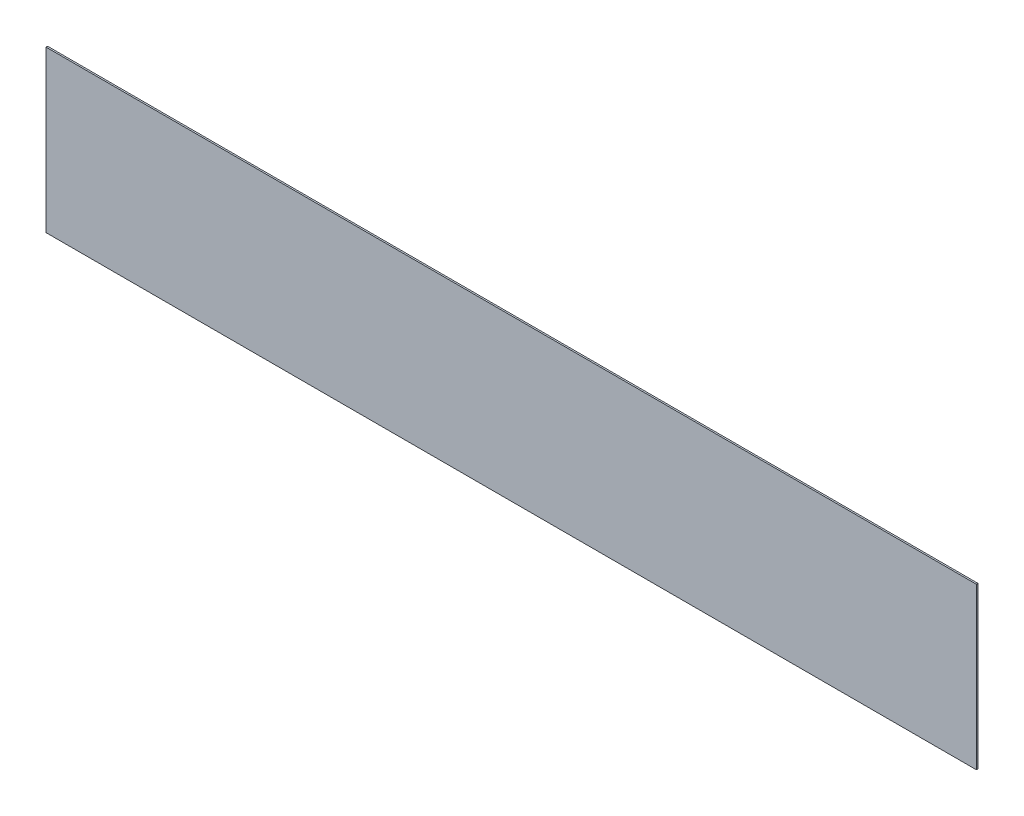
ISO-10303-21;
HEADER;
FILE_DESCRIPTION(('STEP AP214'),'2;1');
FILE_NAME('part.step','',(''),(''),'','','');
FILE_SCHEMA(('AUTOMOTIVE_DESIGN { 1 0 10303 214 1 1 1 1 }'));
ENDSEC;
DATA;
#1=APPLICATION_CONTEXT('core data for automotive mechanical design processes');
#2=APPLICATION_PROTOCOL_DEFINITION('international standard','automotive_design',2000,#1);
#3=PRODUCT_CONTEXT('',#1,'mechanical');
#4=PRODUCT('Part','Part','',(#3));
#5=PRODUCT_RELATED_PRODUCT_CATEGORY('part','',(#4));
#6=PRODUCT_DEFINITION_FORMATION('','',#4);
#7=PRODUCT_DEFINITION_CONTEXT('part definition',#1,'design');
#8=PRODUCT_DEFINITION('design','',#6,#7);
#9=PRODUCT_DEFINITION_SHAPE('','',#8);
#10=(LENGTH_UNIT() NAMED_UNIT(*) SI_UNIT(.MILLI.,.METRE.));
#11=(NAMED_UNIT(*) PLANE_ANGLE_UNIT() SI_UNIT($,.RADIAN.));
#12=(NAMED_UNIT(*) SI_UNIT($,.STERADIAN.) SOLID_ANGLE_UNIT());
#13=UNCERTAINTY_MEASURE_WITH_UNIT(LENGTH_MEASURE(1.E-05),#10,'distance_accuracy_value','');
#14=(GEOMETRIC_REPRESENTATION_CONTEXT(3) GLOBAL_UNCERTAINTY_ASSIGNED_CONTEXT((#13)) GLOBAL_UNIT_ASSIGNED_CONTEXT((#10,
#11,#12)) REPRESENTATION_CONTEXT('',''));
#15=CARTESIAN_POINT('',(0.,0.,0.));
#16=DIRECTION('',(0.,0.,1.));
#17=DIRECTION('',(1.,0.,0.));
#18=AXIS2_PLACEMENT_3D('',#15,#16,#17);
#19=CARTESIAN_POINT('',(13.7,4.,-700.));
#20=DIRECTION('',(-1.,0.,0.));
#21=DIRECTION('',(0.,0.,1.));
#22=AXIS2_PLACEMENT_3D('',#19,#20,#21);
#23=PLANE('',#22);
#24=DIRECTION('',(0.,-1.,0.));
#25=VECTOR('',#24,1.);
#26=CARTESIAN_POINT('',(13.7,4.,-699.));
#27=LINE('',#26,#25);
#28=CARTESIAN_POINT('',(13.7,106.,-699.));
#29=VERTEX_POINT('',#28);
#30=CARTESIAN_POINT('',(13.7,4.,-699.));
#31=VERTEX_POINT('',#30);
#32=EDGE_CURVE('E103',#29,#31,#27,.T.);
#33=ORIENTED_EDGE('',*,*,#32,.F.);
#34=DIRECTION('',(0.,0.,1.));
#35=VECTOR('',#34,1.);
#36=CARTESIAN_POINT('',(13.7,106.,-700.));
#37=LINE('',#36,#35);
#38=CARTESIAN_POINT('',(13.7,106.,-700.));
#39=VERTEX_POINT('',#38);
#40=EDGE_CURVE('E11',#39,#29,#37,.T.);
#41=ORIENTED_EDGE('',*,*,#40,.F.);
#42=DIRECTION('',(0.,-1.,0.));
#43=VECTOR('',#42,1.);
#44=CARTESIAN_POINT('',(13.7,4.,-700.));
#45=LINE('',#44,#43);
#46=CARTESIAN_POINT('',(13.7,4.,-700.));
#47=VERTEX_POINT('',#46);
#48=EDGE_CURVE('E97',#39,#47,#45,.T.);
#49=ORIENTED_EDGE('',*,*,#48,.T.);
#50=DIRECTION('',(0.,0.,1.));
#51=VECTOR('',#50,1.);
#52=CARTESIAN_POINT('',(13.7,4.,-700.));
#53=LINE('',#52,#51);
#54=EDGE_CURVE('E42',#47,#31,#53,.T.);
#55=ORIENTED_EDGE('',*,*,#54,.T.);
#56=EDGE_LOOP('',(#33,#41,#49,#55));
#57=FACE_BOUND('',#56,.T.);
#58=ADVANCED_FACE('F39',(#57),#23,.T.);
#59=CARTESIAN_POINT('',(13.7,106.,-700.));
#60=DIRECTION('',(0.,1.,0.));
#61=DIRECTION('',(0.,0.,1.));
#62=AXIS2_PLACEMENT_3D('',#59,#60,#61);
#63=PLANE('',#62);
#64=DIRECTION('',(-1.,0.,0.));
#65=VECTOR('',#64,1.);
#66=CARTESIAN_POINT('',(13.7,106.,-699.));
#67=LINE('',#66,#65);
#68=CARTESIAN_POINT('',(604.3,106.,-699.));
#69=VERTEX_POINT('',#68);
#70=EDGE_CURVE('E99',#69,#29,#67,.T.);
#71=ORIENTED_EDGE('',*,*,#70,.F.);
#72=DIRECTION('',(0.,0.,1.));
#73=VECTOR('',#72,1.);
#74=CARTESIAN_POINT('',(604.3,106.,-700.));
#75=LINE('',#74,#73);
#76=CARTESIAN_POINT('',(604.3,106.,-700.));
#77=VERTEX_POINT('',#76);
#78=EDGE_CURVE('E48',#77,#69,#75,.T.);
#79=ORIENTED_EDGE('',*,*,#78,.F.);
#80=DIRECTION('',(-1.,0.,0.));
#81=VECTOR('',#80,1.);
#82=CARTESIAN_POINT('',(13.7,106.,-700.));
#83=LINE('',#82,#81);
#84=EDGE_CURVE('E94',#77,#39,#83,.T.);
#85=ORIENTED_EDGE('',*,*,#84,.T.);
#86=ORIENTED_EDGE('',*,*,#40,.T.);
#87=EDGE_LOOP('',(#71,#79,#85,#86));
#88=FACE_BOUND('',#87,.T.);
#89=ADVANCED_FACE('F113',(#88),#63,.T.);
#90=CARTESIAN_POINT('',(604.3,4.,-700.));
#91=DIRECTION('',(1.,0.,0.));
#92=DIRECTION('',(0.,0.,-1.));
#93=AXIS2_PLACEMENT_3D('',#90,#91,#92);
#94=PLANE('',#93);
#95=DIRECTION('',(0.,1.,0.));
#96=VECTOR('',#95,1.);
#97=CARTESIAN_POINT('',(604.3,4.,-699.));
#98=LINE('',#97,#96);
#99=CARTESIAN_POINT('',(604.3,4.,-699.));
#100=VERTEX_POINT('',#99);
#101=EDGE_CURVE('E89',#100,#69,#98,.T.);
#102=ORIENTED_EDGE('',*,*,#101,.F.);
#103=DIRECTION('',(0.,0.,1.));
#104=VECTOR('',#103,1.);
#105=CARTESIAN_POINT('',(604.3,4.,-700.));
#106=LINE('',#105,#104);
#107=CARTESIAN_POINT('',(604.3,4.,-700.));
#108=VERTEX_POINT('',#107);
#109=EDGE_CURVE('E84',#108,#100,#106,.T.);
#110=ORIENTED_EDGE('',*,*,#109,.F.);
#111=DIRECTION('',(0.,1.,0.));
#112=VECTOR('',#111,1.);
#113=CARTESIAN_POINT('',(604.3,4.,-700.));
#114=LINE('',#113,#112);
#115=EDGE_CURVE('E87',#108,#77,#114,.T.);
#116=ORIENTED_EDGE('',*,*,#115,.T.);
#117=ORIENTED_EDGE('',*,*,#78,.T.);
#118=EDGE_LOOP('',(#102,#110,#116,#117));
#119=FACE_BOUND('',#118,.T.);
#120=ADVANCED_FACE('F86',(#119),#94,.T.);
#121=CARTESIAN_POINT('',(13.7,4.,-700.));
#122=DIRECTION('',(0.,-1.,0.));
#123=DIRECTION('',(0.,0.,-1.));
#124=AXIS2_PLACEMENT_3D('',#121,#122,#123);
#125=PLANE('',#124);
#126=DIRECTION('',(1.,0.,0.));
#127=VECTOR('',#126,1.);
#128=CARTESIAN_POINT('',(13.7,4.,-699.));
#129=LINE('',#128,#127);
#130=EDGE_CURVE('E106',#31,#100,#129,.T.);
#131=ORIENTED_EDGE('',*,*,#130,.F.);
#132=ORIENTED_EDGE('',*,*,#54,.F.);
#133=DIRECTION('',(1.,0.,0.));
#134=VECTOR('',#133,1.);
#135=CARTESIAN_POINT('',(13.7,4.,-700.));
#136=LINE('',#135,#134);
#137=EDGE_CURVE('E93',#47,#108,#136,.T.);
#138=ORIENTED_EDGE('',*,*,#137,.T.);
#139=ORIENTED_EDGE('',*,*,#109,.T.);
#140=EDGE_LOOP('',(#131,#132,#138,#139));
#141=FACE_BOUND('',#140,.T.);
#142=ADVANCED_FACE('F96',(#141),#125,.T.);
#143=CARTESIAN_POINT('',(0.,0.,-700.));
#144=DIRECTION('',(0.,0.,-1.));
#145=DIRECTION('',(-1.,0.,0.));
#146=AXIS2_PLACEMENT_3D('',#143,#144,#145);
#147=PLANE('',#146);
#148=ORIENTED_EDGE('',*,*,#48,.F.);
#149=ORIENTED_EDGE('',*,*,#84,.F.);
#150=ORIENTED_EDGE('',*,*,#115,.F.);
#151=ORIENTED_EDGE('',*,*,#137,.F.);
#152=EDGE_LOOP('',(#148,#149,#150,#151));
#153=FACE_BOUND('',#152,.T.);
#154=ADVANCED_FACE('F92',(#153),#147,.T.);
#155=CARTESIAN_POINT('',(0.,0.,-699.));
#156=DIRECTION('',(0.,0.,-1.));
#157=DIRECTION('',(-1.,0.,0.));
#158=AXIS2_PLACEMENT_3D('',#155,#156,#157);
#159=PLANE('',#158);
#160=ORIENTED_EDGE('',*,*,#32,.T.);
#161=ORIENTED_EDGE('',*,*,#130,.T.);
#162=ORIENTED_EDGE('',*,*,#101,.T.);
#163=ORIENTED_EDGE('',*,*,#70,.T.);
#164=EDGE_LOOP('',(#160,#161,#162,#163));
#165=FACE_BOUND('',#164,.T.);
#166=ADVANCED_FACE('F112',(#165),#159,.F.);
#167=CLOSED_SHELL('',(#58,#89,#120,#142,#154,#166));
#168=MANIFOLD_SOLID_BREP('B2',#167);
#169=ADVANCED_BREP_SHAPE_REPRESENTATION('',(#18,#168),#14);
#170=SHAPE_DEFINITION_REPRESENTATION(#9,#169);
ENDSEC;
END-ISO-10303-21;
